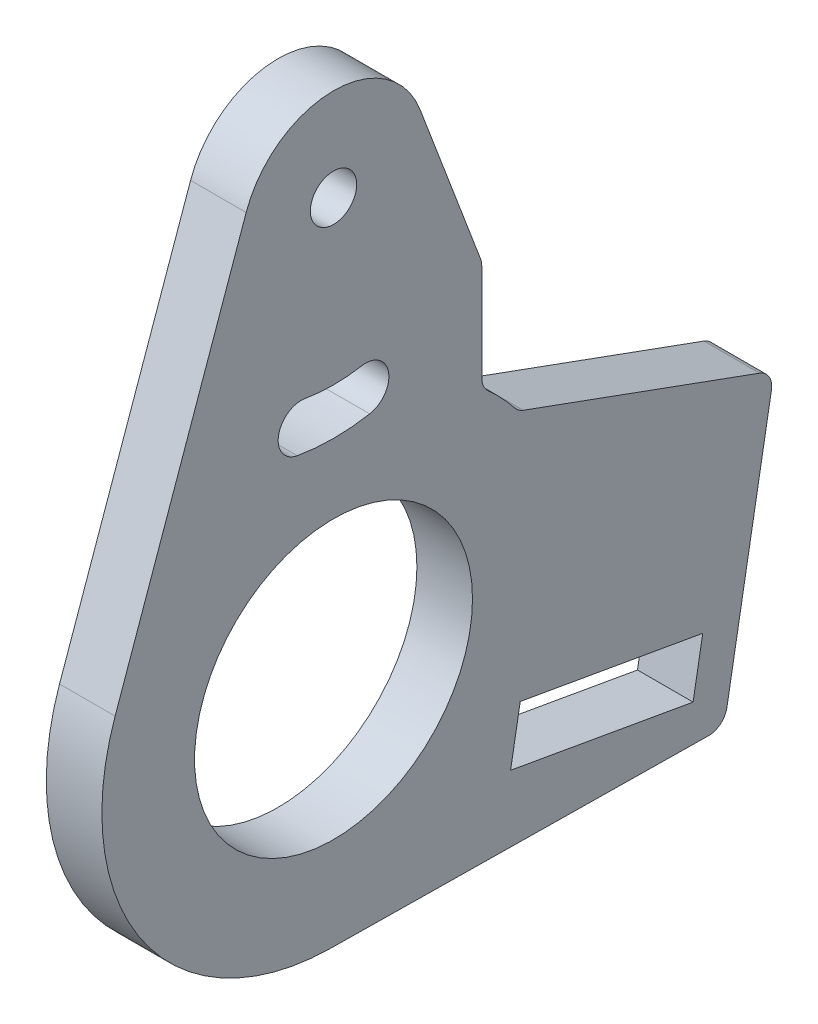
ISO-10303-21;
HEADER;
FILE_DESCRIPTION(('STEP AP214'),'2;1');
FILE_NAME('part.step','',(''),(''),'','','');
FILE_SCHEMA(('AUTOMOTIVE_DESIGN { 1 0 10303 214 1 1 1 1 }'));
ENDSEC;
DATA;
#1=APPLICATION_CONTEXT('core data for automotive mechanical design processes');
#2=APPLICATION_PROTOCOL_DEFINITION('international standard','automotive_design',2000,#1);
#3=PRODUCT_CONTEXT('',#1,'mechanical');
#4=PRODUCT('Part','Part','',(#3));
#5=PRODUCT_RELATED_PRODUCT_CATEGORY('part','',(#4));
#6=PRODUCT_DEFINITION_FORMATION('','',#4);
#7=PRODUCT_DEFINITION_CONTEXT('part definition',#1,'design');
#8=PRODUCT_DEFINITION('design','',#6,#7);
#9=PRODUCT_DEFINITION_SHAPE('','',#8);
#10=(LENGTH_UNIT() NAMED_UNIT(*) SI_UNIT(.MILLI.,.METRE.));
#11=(NAMED_UNIT(*) PLANE_ANGLE_UNIT() SI_UNIT($,.RADIAN.));
#12=(NAMED_UNIT(*) SI_UNIT($,.STERADIAN.) SOLID_ANGLE_UNIT());
#13=UNCERTAINTY_MEASURE_WITH_UNIT(LENGTH_MEASURE(1.E-05),#10,'distance_accuracy_value','');
#14=(GEOMETRIC_REPRESENTATION_CONTEXT(3) GLOBAL_UNCERTAINTY_ASSIGNED_CONTEXT((#13)) GLOBAL_UNIT_ASSIGNED_CONTEXT((#10,
#11,#12)) REPRESENTATION_CONTEXT('',''));
#15=CARTESIAN_POINT('',(0.,0.,0.));
#16=DIRECTION('',(0.,0.,1.));
#17=DIRECTION('',(1.,0.,0.));
#18=AXIS2_PLACEMENT_3D('',#15,#16,#17);
#19=CARTESIAN_POINT('',(6.,-30.,50.));
#20=DIRECTION('',(-1.,0.,0.));
#21=DIRECTION('',(0.,0.,1.));
#22=AXIS2_PLACEMENT_3D('',#19,#20,#21);
#23=PLANE('',#22);
#24=CARTESIAN_POINT('',(6.,15.,50.));
#25=DIRECTION('',(1.,0.,0.));
#26=DIRECTION('',(0.,0.,-1.));
#27=AXIS2_PLACEMENT_3D('',#24,#25,#26);
#28=CIRCLE('',#27,2.49999999999999);
#29=CARTESIAN_POINT('',(6.,15.,47.5));
#30=VERTEX_POINT('',#29);
#31=EDGE_CURVE('E248',#30,#30,#28,.T.);
#32=ORIENTED_EDGE('',*,*,#31,.F.);
#33=EDGE_LOOP('',(#32));
#34=FACE_BOUND('',#33,.T.);
#35=DIRECTION('',(0.,-0.173648177666929,-0.984807753012208));
#36=VECTOR('',#35,1.);
#37=CARTESIAN_POINT('',(6.,-51.5453282947425,11.1938115358795));
#38=LINE('',#37,#36);
#39=CARTESIAN_POINT('',(6.,-48.072364741404,30.8899665961236));
#40=VERTEX_POINT('',#39);
#41=CARTESIAN_POINT('',(6.,-51.5453282947425,11.1938115358795));
#42=VERTEX_POINT('',#41);
#43=EDGE_CURVE('E256',#40,#42,#38,.T.);
#44=ORIENTED_EDGE('',*,*,#43,.F.);
#45=DIRECTION('',(0.,-0.984807753012208,0.173648177666931));
#46=VECTOR('',#45,1.);
#47=CARTESIAN_POINT('',(6.,-48.072364741404,30.8899665961236));
#48=LINE('',#47,#46);
#49=CARTESIAN_POINT('',(6.,-42.1635182233307,29.8480775301221));
#50=VERTEX_POINT('',#49);
#51=EDGE_CURVE('E267',#50,#40,#48,.T.);
#52=ORIENTED_EDGE('',*,*,#51,.F.);
#53=DIRECTION('',(0.,0.173648177666929,0.984807753012208));
#54=VECTOR('',#53,1.);
#55=CARTESIAN_POINT('',(6.,-42.1635182233307,29.8480775301221));
#56=LINE('',#55,#54);
#57=CARTESIAN_POINT('',(6.,-45.6364817766693,10.1519224698779));
#58=VERTEX_POINT('',#57);
#59=EDGE_CURVE('E263',#58,#50,#56,.T.);
#60=ORIENTED_EDGE('',*,*,#59,.F.);
#61=DIRECTION('',(0.,0.984807753012208,-0.173648177666929));
#62=VECTOR('',#61,1.);
#63=CARTESIAN_POINT('',(6.,-45.6364817766693,10.1519224698779));
#64=LINE('',#63,#62);
#65=EDGE_CURVE('E259',#42,#58,#64,.T.);
#66=ORIENTED_EDGE('',*,*,#65,.F.);
#67=EDGE_LOOP('',(#44,#52,#60,#66));
#68=FACE_BOUND('',#67,.T.);
#69=DIRECTION('',(0.,-0.0128836518435518,-0.999917002313279));
#70=VECTOR('',#69,1.);
#71=CARTESIAN_POINT('',(6.,-54.997925057832,50.3220912960888));
#72=LINE('',#71,#70);
#73=CARTESIAN_POINT('',(6.,-54.997925057832,50.3220912960888));
#74=VERTEX_POINT('',#73);
#75=CARTESIAN_POINT('',(6.,-55.5234225515819,9.53754627312334));
#76=VERTEX_POINT('',#75);
#77=EDGE_CURVE('E328',#74,#76,#72,.T.);
#78=ORIENTED_EDGE('',*,*,#77,.T.);
#79=CARTESIAN_POINT('',(6.,-53.5235885469553,9.51177896943623));
#80=DIRECTION('',(-1.,0.,0.));
#81=DIRECTION('',(0.,0.,1.));
#82=AXIS2_PLACEMENT_3D('',#79,#80,#81);
#83=CIRCLE('',#82,2.);
#84=CARTESIAN_POINT('',(6.,-53.8708849022892,7.54216346341182));
#85=VERTEX_POINT('',#84);
#86=EDGE_CURVE('E407',#76,#85,#83,.F.);
#87=ORIENTED_EDGE('',*,*,#86,.T.);
#88=DIRECTION('',(0.,0.984807753012208,-0.17364817766693));
#89=VECTOR('',#88,1.);
#90=CARTESIAN_POINT('',(6.,-55.5453282947425,7.83741301117036));
#91=LINE('',#90,#89);
#92=CARTESIAN_POINT('',(6.,-26.6137294901861,2.73599154689431));
#93=VERTEX_POINT('',#92);
#94=EDGE_CURVE('E332',#85,#93,#91,.T.);
#95=ORIENTED_EDGE('',*,*,#94,.T.);
#96=CARTESIAN_POINT('',(6.,-26.2664331348523,4.70560705291873));
#97=DIRECTION('',(-1.,0.,0.));
#98=DIRECTION('',(0.,0.,1.));
#99=AXIS2_PLACEMENT_3D('',#96,#97,#98);
#100=CIRCLE('',#99,2.);
#101=CARTESIAN_POINT('',(6.,-24.3870478932805,4.02156676626739));
#102=VERTEX_POINT('',#101);
#103=EDGE_CURVE('E66',#93,#102,#100,.F.);
#104=ORIENTED_EDGE('',*,*,#103,.T.);
#105=DIRECTION('',(0.,0.342020143325669,0.939692620785908));
#106=VECTOR('',#105,1.);
#107=CARTESIAN_POINT('',(6.,-14.9058419093169,30.0709661164053));
#108=LINE('',#107,#106);
#109=CARTESIAN_POINT('',(6.,-15.1033502164555,29.5283165023874));
#110=VERTEX_POINT('',#109);
#111=EDGE_CURVE('E335',#102,#110,#108,.T.);
#112=ORIENTED_EDGE('',*,*,#111,.T.);
#113=CARTESIAN_POINT('',(6.,-13.2239649748836,28.8442762157361));
#114=DIRECTION('',(-1.,0.,0.));
#115=DIRECTION('',(0.,0.,1.));
#116=AXIS2_PLACEMENT_3D('',#113,#114,#115);
#117=CIRCLE('',#116,2.);
#118=CARTESIAN_POINT('',(6.,-14.4666342360034,30.4113668664223));
#119=VERTEX_POINT('',#118);
#120=EDGE_CURVE('E437',#110,#119,#117,.T.);
#121=ORIENTED_EDGE('',*,*,#120,.T.);
#122=CARTESIAN_POINT('',(6.,-30.,50.));
#123=DIRECTION('',(1.,0.,0.));
#124=DIRECTION('',(0.,0.,1.));
#125=AXIS2_PLACEMENT_3D('',#122,#123,#124);
#126=CIRCLE('',#125,25.);
#127=CARTESIAN_POINT('',(6.,-11.3661001875018,33.3333333333333));
#128=VERTEX_POINT('',#127);
#129=EDGE_CURVE('E307',#119,#128,#126,.T.);
#130=ORIENTED_EDGE('',*,*,#129,.T.);
#131=CARTESIAN_POINT('',(6.,-9.87538820250189,32.));
#132=DIRECTION('',(-1.,0.,0.));
#133=DIRECTION('',(0.,0.,1.));
#134=AXIS2_PLACEMENT_3D('',#131,#132,#133);
#135=CIRCLE('',#134,2.);
#136=CARTESIAN_POINT('',(6.,-9.87538820250189,34.));
#137=VERTEX_POINT('',#136);
#138=EDGE_CURVE('E11',#128,#137,#135,.T.);
#139=ORIENTED_EDGE('',*,*,#138,.T.);
#140=DIRECTION('',(0.,1.,0.));
#141=VECTOR('',#140,1.);
#142=CARTESIAN_POINT('',(6.,-10.7906272877015,34.));
#143=LINE('',#142,#141);
#144=CARTESIAN_POINT('',(6.,0.633718227746634,34.));
#145=VERTEX_POINT('',#144);
#146=EDGE_CURVE('E311',#137,#145,#143,.T.);
#147=ORIENTED_EDGE('',*,*,#146,.T.);
#148=CARTESIAN_POINT('',(6.,0.633718227746637,36.));
#149=DIRECTION('',(-1.,0.,0.));
#150=DIRECTION('',(0.,0.,1.));
#151=AXIS2_PLACEMENT_3D('',#148,#149,#150);
#152=CIRCLE('',#151,2.);
#153=CARTESIAN_POINT('',(6.,1.34250853141345,34.1298084842915));
#154=VERTEX_POINT('',#153);
#155=EDGE_CURVE('E402',#145,#154,#152,.F.);
#156=ORIENTED_EDGE('',*,*,#155,.T.);
#157=DIRECTION('',(0.,0.935095757854231,0.354395151833405));
#158=VECTOR('',#157,1.);
#159=CARTESIAN_POINT('',(6.,0.999999999999997,34.));
#160=LINE('',#159,#158);
#161=CARTESIAN_POINT('',(6.,18.5439515183341,40.6490424214577));
#162=VERTEX_POINT('',#161);
#163=EDGE_CURVE('E316',#154,#162,#160,.T.);
#164=ORIENTED_EDGE('',*,*,#163,.T.);
#165=CARTESIAN_POINT('',(6.,15.,50.));
#166=DIRECTION('',(1.,0.,0.));
#167=DIRECTION('',(0.,0.,-1.));
#168=AXIS2_PLACEMENT_3D('',#165,#166,#167);
#169=CIRCLE('',#168,10.);
#170=CARTESIAN_POINT('',(6.,18.3333333333333,59.4280904158206));
#171=VERTEX_POINT('',#170);
#172=EDGE_CURVE('E319',#162,#171,#169,.T.);
#173=ORIENTED_EDGE('',*,*,#172,.T.);
#174=DIRECTION('',(0.,-0.942809041582063,0.333333333333333));
#175=VECTOR('',#174,1.);
#176=CARTESIAN_POINT('',(6.,18.3333333333333,59.4280904158206));
#177=LINE('',#176,#175);
#178=CARTESIAN_POINT('',(6.,-21.6666666666667,73.5702260395516));
#179=VERTEX_POINT('',#178);
#180=EDGE_CURVE('E322',#171,#179,#177,.T.);
#181=ORIENTED_EDGE('',*,*,#180,.T.);
#182=CARTESIAN_POINT('',(6.,-30.,50.));
#183=DIRECTION('',(1.,0.,0.));
#184=DIRECTION('',(0.,0.,-1.));
#185=AXIS2_PLACEMENT_3D('',#182,#183,#184);
#186=CIRCLE('',#185,25.);
#187=EDGE_CURVE('E325',#179,#74,#186,.T.);
#188=ORIENTED_EDGE('',*,*,#187,.T.);
#189=EDGE_LOOP('',(#78,#87,#95,#104,#112,#121,#130,#139,#147,#156,#164,#173,#181,#188));
#190=FACE_BOUND('',#189,.T.);
#191=CARTESIAN_POINT('',(6.,-30.,50.));
#192=DIRECTION('',(1.,0.,0.));
#193=DIRECTION('',(0.,0.,-1.));
#194=AXIS2_PLACEMENT_3D('',#191,#192,#193);
#195=CIRCLE('',#194,15.);
#196=CARTESIAN_POINT('',(6.,-30.,35.));
#197=VERTEX_POINT('',#196);
#198=EDGE_CURVE('E299',#197,#197,#195,.T.);
#199=ORIENTED_EDGE('',*,*,#198,.F.);
#200=EDGE_LOOP('',(#199));
#201=FACE_BOUND('',#200,.T.);
#202=CARTESIAN_POINT('',(6.,15.,50.));
#203=DIRECTION('',(-1.,0.,0.));
#204=DIRECTION('',(0.,0.,-1.));
#205=AXIS2_PLACEMENT_3D('',#202,#203,#204);
#206=CIRCLE('',#205,17.5);
#207=CARTESIAN_POINT('',(6.,-2.23413567771363,46.9611568908287));
#208=VERTEX_POINT('',#207);
#209=CARTESIAN_POINT('',(6.,-2.23413567771363,53.0388431091713));
#210=VERTEX_POINT('',#209);
#211=EDGE_CURVE('E195',#208,#210,#206,.T.);
#212=ORIENTED_EDGE('',*,*,#211,.F.);
#213=CARTESIAN_POINT('',(6.,-4.69615506024415,46.5270364466614));
#214=DIRECTION('',(1.,0.,0.));
#215=DIRECTION('',(0.,0.,-1.));
#216=AXIS2_PLACEMENT_3D('',#213,#214,#215);
#217=CIRCLE('',#216,2.5);
#218=CARTESIAN_POINT('',(6.,-7.15817444277467,46.092916002494));
#219=VERTEX_POINT('',#218);
#220=EDGE_CURVE('E224',#219,#208,#217,.T.);
#221=ORIENTED_EDGE('',*,*,#220,.F.);
#222=CARTESIAN_POINT('',(6.,15.,50.));
#223=DIRECTION('',(1.,0.,0.));
#224=DIRECTION('',(0.,0.,-1.));
#225=AXIS2_PLACEMENT_3D('',#222,#223,#224);
#226=CIRCLE('',#225,22.5);
#227=CARTESIAN_POINT('',(6.,-7.15817444277467,53.907083997506));
#228=VERTEX_POINT('',#227);
#229=EDGE_CURVE('E220',#228,#219,#226,.T.);
#230=ORIENTED_EDGE('',*,*,#229,.F.);
#231=CARTESIAN_POINT('',(6.,-4.69615506024415,53.4729635533386));
#232=DIRECTION('',(1.,0.,0.));
#233=DIRECTION('',(0.,0.,-1.));
#234=AXIS2_PLACEMENT_3D('',#231,#232,#233);
#235=CIRCLE('',#234,2.5);
#236=EDGE_CURVE('E206',#210,#228,#235,.T.);
#237=ORIENTED_EDGE('',*,*,#236,.F.);
#238=EDGE_LOOP('',(#212,#221,#230,#237));
#239=FACE_BOUND('',#238,.T.);
#240=ADVANCED_FACE('F43',(#34,#68,#190,#201,#239),#23,.F.);
#241=CARTESIAN_POINT('',(0.,-30.,50.));
#242=DIRECTION('',(-1.,0.,0.));
#243=DIRECTION('',(0.,0.,1.));
#244=AXIS2_PLACEMENT_3D('',#241,#242,#243);
#245=PLANE('',#244);
#246=DIRECTION('',(0.,-0.984807753012208,0.173648177666931));
#247=VECTOR('',#246,1.);
#248=CARTESIAN_POINT('',(0.,-48.072364741404,30.8899665961236));
#249=LINE('',#248,#247);
#250=CARTESIAN_POINT('',(0.,-42.1635182233307,29.8480775301221));
#251=VERTEX_POINT('',#250);
#252=CARTESIAN_POINT('',(0.,-48.072364741404,30.8899665961236));
#253=VERTEX_POINT('',#252);
#254=EDGE_CURVE('E260',#251,#253,#249,.T.);
#255=ORIENTED_EDGE('',*,*,#254,.T.);
#256=DIRECTION('',(0.,-0.173648177666929,-0.984807753012208));
#257=VECTOR('',#256,1.);
#258=CARTESIAN_POINT('',(0.,-51.5453282947425,11.1938115358795));
#259=LINE('',#258,#257);
#260=CARTESIAN_POINT('',(0.,-51.5453282947425,11.1938115358795));
#261=VERTEX_POINT('',#260);
#262=EDGE_CURVE('E252',#253,#261,#259,.T.);
#263=ORIENTED_EDGE('',*,*,#262,.T.);
#264=DIRECTION('',(0.,0.984807753012208,-0.173648177666929));
#265=VECTOR('',#264,1.);
#266=CARTESIAN_POINT('',(0.,-45.6364817766693,10.1519224698779));
#267=LINE('',#266,#265);
#268=CARTESIAN_POINT('',(0.,-45.6364817766693,10.1519224698779));
#269=VERTEX_POINT('',#268);
#270=EDGE_CURVE('E274',#261,#269,#267,.T.);
#271=ORIENTED_EDGE('',*,*,#270,.T.);
#272=DIRECTION('',(0.,0.173648177666929,0.984807753012208));
#273=VECTOR('',#272,1.);
#274=CARTESIAN_POINT('',(0.,-42.1635182233307,29.8480775301221));
#275=LINE('',#274,#273);
#276=EDGE_CURVE('E278',#269,#251,#275,.T.);
#277=ORIENTED_EDGE('',*,*,#276,.T.);
#278=EDGE_LOOP('',(#255,#263,#271,#277));
#279=FACE_BOUND('',#278,.T.);
#280=CARTESIAN_POINT('',(0.,-30.,50.));
#281=DIRECTION('',(1.,0.,0.));
#282=DIRECTION('',(0.,0.,-1.));
#283=AXIS2_PLACEMENT_3D('',#280,#281,#282);
#284=CIRCLE('',#283,15.);
#285=CARTESIAN_POINT('',(0.,-30.,35.));
#286=VERTEX_POINT('',#285);
#287=EDGE_CURVE('E298',#286,#286,#284,.T.);
#288=ORIENTED_EDGE('',*,*,#287,.T.);
#289=EDGE_LOOP('',(#288));
#290=FACE_BOUND('',#289,.T.);
#291=DIRECTION('',(0.,0.984807753012208,-0.17364817766693));
#292=VECTOR('',#291,1.);
#293=CARTESIAN_POINT('',(0.,-55.5453282947425,7.83741301117036));
#294=LINE('',#293,#292);
#295=CARTESIAN_POINT('',(0.,-53.8708849022892,7.54216346341182));
#296=VERTEX_POINT('',#295);
#297=CARTESIAN_POINT('',(0.,-26.6137294901861,2.73599154689431));
#298=VERTEX_POINT('',#297);
#299=EDGE_CURVE('E362',#296,#298,#294,.T.);
#300=ORIENTED_EDGE('',*,*,#299,.F.);
#301=CARTESIAN_POINT('',(0.,-53.5235885469553,9.51177896943623));
#302=DIRECTION('',(-1.,0.,0.));
#303=DIRECTION('',(0.,0.,1.));
#304=AXIS2_PLACEMENT_3D('',#301,#302,#303);
#305=CIRCLE('',#304,2.);
#306=CARTESIAN_POINT('',(0.,-55.5234225515819,9.53754627312334));
#307=VERTEX_POINT('',#306);
#308=EDGE_CURVE('E396',#296,#307,#305,.T.);
#309=ORIENTED_EDGE('',*,*,#308,.T.);
#310=DIRECTION('',(0.,-0.0128836518435518,-0.999917002313279));
#311=VECTOR('',#310,1.);
#312=CARTESIAN_POINT('',(0.,-54.997925057832,50.3220912960888));
#313=LINE('',#312,#311);
#314=CARTESIAN_POINT('',(0.,-54.997925057832,50.3220912960888));
#315=VERTEX_POINT('',#314);
#316=EDGE_CURVE('E358',#315,#307,#313,.T.);
#317=ORIENTED_EDGE('',*,*,#316,.F.);
#318=CARTESIAN_POINT('',(0.,-30.,50.));
#319=DIRECTION('',(1.,0.,0.));
#320=DIRECTION('',(0.,0.,-1.));
#321=AXIS2_PLACEMENT_3D('',#318,#319,#320);
#322=CIRCLE('',#321,25.);
#323=CARTESIAN_POINT('',(0.,-21.6666666666667,73.5702260395516));
#324=VERTEX_POINT('',#323);
#325=EDGE_CURVE('E355',#324,#315,#322,.T.);
#326=ORIENTED_EDGE('',*,*,#325,.F.);
#327=DIRECTION('',(0.,-0.942809041582063,0.333333333333333));
#328=VECTOR('',#327,1.);
#329=CARTESIAN_POINT('',(0.,18.3333333333333,59.4280904158206));
#330=LINE('',#329,#328);
#331=CARTESIAN_POINT('',(0.,18.3333333333333,59.4280904158206));
#332=VERTEX_POINT('',#331);
#333=EDGE_CURVE('E352',#332,#324,#330,.T.);
#334=ORIENTED_EDGE('',*,*,#333,.F.);
#335=CARTESIAN_POINT('',(0.,15.,50.));
#336=DIRECTION('',(1.,0.,0.));
#337=DIRECTION('',(0.,0.,-1.));
#338=AXIS2_PLACEMENT_3D('',#335,#336,#337);
#339=CIRCLE('',#338,10.);
#340=CARTESIAN_POINT('',(0.,18.5439515183341,40.6490424214577));
#341=VERTEX_POINT('',#340);
#342=EDGE_CURVE('E349',#341,#332,#339,.T.);
#343=ORIENTED_EDGE('',*,*,#342,.F.);
#344=DIRECTION('',(0.,0.935095757854231,0.354395151833405));
#345=VECTOR('',#344,1.);
#346=CARTESIAN_POINT('',(0.,0.999999999999997,34.));
#347=LINE('',#346,#345);
#348=CARTESIAN_POINT('',(0.,1.34250853141345,34.1298084842915));
#349=VERTEX_POINT('',#348);
#350=EDGE_CURVE('E346',#349,#341,#347,.T.);
#351=ORIENTED_EDGE('',*,*,#350,.F.);
#352=CARTESIAN_POINT('',(0.,0.633718227746637,36.));
#353=DIRECTION('',(-1.,0.,0.));
#354=DIRECTION('',(0.,0.,1.));
#355=AXIS2_PLACEMENT_3D('',#352,#353,#354);
#356=CIRCLE('',#355,2.);
#357=CARTESIAN_POINT('',(0.,0.633718227746634,34.));
#358=VERTEX_POINT('',#357);
#359=EDGE_CURVE('E390',#349,#358,#356,.T.);
#360=ORIENTED_EDGE('',*,*,#359,.T.);
#361=DIRECTION('',(0.,1.,0.));
#362=VECTOR('',#361,1.);
#363=CARTESIAN_POINT('',(0.,-10.7906272877015,34.));
#364=LINE('',#363,#362);
#365=CARTESIAN_POINT('',(0.,-9.87538820250189,34.));
#366=VERTEX_POINT('',#365);
#367=EDGE_CURVE('E342',#366,#358,#364,.T.);
#368=ORIENTED_EDGE('',*,*,#367,.F.);
#369=CARTESIAN_POINT('',(0.,-9.87538820250189,32.));
#370=DIRECTION('',(-1.,0.,0.));
#371=DIRECTION('',(0.,0.,1.));
#372=AXIS2_PLACEMENT_3D('',#369,#370,#371);
#373=CIRCLE('',#372,2.);
#374=CARTESIAN_POINT('',(0.,-11.3661001875018,33.3333333333333));
#375=VERTEX_POINT('',#374);
#376=EDGE_CURVE('E52',#366,#375,#373,.F.);
#377=ORIENTED_EDGE('',*,*,#376,.T.);
#378=CARTESIAN_POINT('',(0.,-30.,50.));
#379=DIRECTION('',(1.,0.,0.));
#380=DIRECTION('',(0.,0.,1.));
#381=AXIS2_PLACEMENT_3D('',#378,#379,#380);
#382=CIRCLE('',#381,25.);
#383=CARTESIAN_POINT('',(0.,-14.4666342360034,30.4113668664223));
#384=VERTEX_POINT('',#383);
#385=EDGE_CURVE('E303',#384,#375,#382,.T.);
#386=ORIENTED_EDGE('',*,*,#385,.F.);
#387=CARTESIAN_POINT('',(0.,-13.2239649748836,28.8442762157361));
#388=DIRECTION('',(-1.,0.,0.));
#389=DIRECTION('',(0.,0.,1.));
#390=AXIS2_PLACEMENT_3D('',#387,#388,#389);
#391=CIRCLE('',#390,2.);
#392=CARTESIAN_POINT('',(0.,-15.1033502164555,29.5283165023874));
#393=VERTEX_POINT('',#392);
#394=EDGE_CURVE('E434',#384,#393,#391,.F.);
#395=ORIENTED_EDGE('',*,*,#394,.T.);
#396=DIRECTION('',(0.,0.342020143325669,0.939692620785908));
#397=VECTOR('',#396,1.);
#398=CARTESIAN_POINT('',(0.,-14.9058419093169,30.0709661164053));
#399=LINE('',#398,#397);
#400=CARTESIAN_POINT('',(0.,-24.3870478932805,4.02156676626739));
#401=VERTEX_POINT('',#400);
#402=EDGE_CURVE('E312',#401,#393,#399,.T.);
#403=ORIENTED_EDGE('',*,*,#402,.F.);
#404=CARTESIAN_POINT('',(0.,-26.2664331348523,4.70560705291873));
#405=DIRECTION('',(-1.,0.,0.));
#406=DIRECTION('',(0.,0.,1.));
#407=AXIS2_PLACEMENT_3D('',#404,#405,#406);
#408=CIRCLE('',#407,2.);
#409=EDGE_CURVE('E393',#401,#298,#408,.T.);
#410=ORIENTED_EDGE('',*,*,#409,.T.);
#411=EDGE_LOOP('',(#300,#309,#317,#326,#334,#343,#351,#360,#368,#377,#386,#395,#403,#410));
#412=FACE_BOUND('',#411,.T.);
#413=CARTESIAN_POINT('',(0.,15.,50.));
#414=DIRECTION('',(1.,0.,0.));
#415=DIRECTION('',(0.,0.,-1.));
#416=AXIS2_PLACEMENT_3D('',#413,#414,#415);
#417=CIRCLE('',#416,2.49999999999999);
#418=CARTESIAN_POINT('',(0.,15.,47.5));
#419=VERTEX_POINT('',#418);
#420=EDGE_CURVE('E215',#419,#419,#417,.T.);
#421=ORIENTED_EDGE('',*,*,#420,.T.);
#422=EDGE_LOOP('',(#421));
#423=FACE_BOUND('',#422,.T.);
#424=CARTESIAN_POINT('',(0.,-4.69615506024415,46.5270364466614));
#425=DIRECTION('',(1.,0.,0.));
#426=DIRECTION('',(0.,0.,-1.));
#427=AXIS2_PLACEMENT_3D('',#424,#425,#426);
#428=CIRCLE('',#427,2.5);
#429=CARTESIAN_POINT('',(0.,-7.15817444277467,46.092916002494));
#430=VERTEX_POINT('',#429);
#431=CARTESIAN_POINT('',(0.,-2.23413567771363,46.9611568908287));
#432=VERTEX_POINT('',#431);
#433=EDGE_CURVE('E207',#430,#432,#428,.T.);
#434=ORIENTED_EDGE('',*,*,#433,.T.);
#435=CARTESIAN_POINT('',(0.,15.,50.));
#436=DIRECTION('',(-1.,0.,0.));
#437=DIRECTION('',(0.,0.,-1.));
#438=AXIS2_PLACEMENT_3D('',#435,#436,#437);
#439=CIRCLE('',#438,17.5);
#440=CARTESIAN_POINT('',(0.,-2.23413567771363,53.0388431091713));
#441=VERTEX_POINT('',#440);
#442=EDGE_CURVE('E229',#432,#441,#439,.T.);
#443=ORIENTED_EDGE('',*,*,#442,.T.);
#444=CARTESIAN_POINT('',(0.,-4.69615506024415,53.4729635533386));
#445=DIRECTION('',(1.,0.,0.));
#446=DIRECTION('',(0.,0.,-1.));
#447=AXIS2_PLACEMENT_3D('',#444,#445,#446);
#448=CIRCLE('',#447,2.5);
#449=CARTESIAN_POINT('',(0.,-7.15817444277467,53.907083997506));
#450=VERTEX_POINT('',#449);
#451=EDGE_CURVE('E213',#441,#450,#448,.T.);
#452=ORIENTED_EDGE('',*,*,#451,.T.);
#453=CARTESIAN_POINT('',(0.,15.,50.));
#454=DIRECTION('',(1.,0.,0.));
#455=DIRECTION('',(0.,0.,-1.));
#456=AXIS2_PLACEMENT_3D('',#453,#454,#455);
#457=CIRCLE('',#456,22.5);
#458=EDGE_CURVE('E234',#450,#430,#457,.T.);
#459=ORIENTED_EDGE('',*,*,#458,.T.);
#460=EDGE_LOOP('',(#434,#443,#452,#459));
#461=FACE_BOUND('',#460,.T.);
#462=ADVANCED_FACE('F444',(#279,#290,#412,#423,#461),#245,.T.);
#463=CARTESIAN_POINT('',(6.,-30.,50.));
#464=DIRECTION('',(-1.,0.,0.));
#465=DIRECTION('',(0.,0.,1.));
#466=AXIS2_PLACEMENT_3D('',#463,#464,#465);
#467=CYLINDRICAL_SURFACE('',#466,25.);
#468=ORIENTED_EDGE('',*,*,#129,.F.);
#469=DIRECTION('',(-1.,0.,0.));
#470=VECTOR('',#469,1.);
#471=CARTESIAN_POINT('',(6.,-14.4666342360034,30.4113668664223));
#472=LINE('',#471,#470);
#473=EDGE_CURVE('E419',#119,#384,#472,.T.);
#474=ORIENTED_EDGE('',*,*,#473,.T.);
#475=ORIENTED_EDGE('',*,*,#385,.T.);
#476=DIRECTION('',(-1.,0.,0.));
#477=VECTOR('',#476,1.);
#478=CARTESIAN_POINT('',(6.,-11.3661001875018,33.3333333333333));
#479=LINE('',#478,#477);
#480=EDGE_CURVE('E416',#375,#128,#479,.F.);
#481=ORIENTED_EDGE('',*,*,#480,.T.);
#482=EDGE_LOOP('',(#468,#474,#475,#481));
#483=FACE_BOUND('',#482,.T.);
#484=ADVANCED_FACE('F451',(#483),#467,.T.);
#485=CARTESIAN_POINT('',(6.,-10.7906272877015,34.));
#486=DIRECTION('',(0.,0.,1.));
#487=DIRECTION('',(1.,0.,0.));
#488=AXIS2_PLACEMENT_3D('',#485,#486,#487);
#489=PLANE('',#488);
#490=ORIENTED_EDGE('',*,*,#367,.T.);
#491=DIRECTION('',(-1.,0.,0.));
#492=VECTOR('',#491,1.);
#493=CARTESIAN_POINT('',(6.,0.633718227746638,34.));
#494=LINE('',#493,#492);
#495=EDGE_CURVE('E431',#358,#145,#494,.F.);
#496=ORIENTED_EDGE('',*,*,#495,.T.);
#497=ORIENTED_EDGE('',*,*,#146,.F.);
#498=DIRECTION('',(1.,0.,0.));
#499=VECTOR('',#498,1.);
#500=CARTESIAN_POINT('',(0.,-9.87538820250189,34.));
#501=LINE('',#500,#499);
#502=EDGE_CURVE('E427',#137,#366,#501,.F.);
#503=ORIENTED_EDGE('',*,*,#502,.T.);
#504=EDGE_LOOP('',(#490,#496,#497,#503));
#505=FACE_BOUND('',#504,.T.);
#506=ADVANCED_FACE('F458',(#505),#489,.F.);
#507=CARTESIAN_POINT('',(6.,0.999999999999997,34.));
#508=DIRECTION('',(0.,-0.354395151833405,0.93509575785423));
#509=DIRECTION('',(0.,-0.935095757854231,-0.354395151833405));
#510=AXIS2_PLACEMENT_3D('',#507,#508,#509);
#511=PLANE('',#510);
#512=ORIENTED_EDGE('',*,*,#163,.F.);
#513=DIRECTION('',(-1.,0.,0.));
#514=VECTOR('',#513,1.);
#515=CARTESIAN_POINT('',(6.,1.34250853141345,34.1298084842915));
#516=LINE('',#515,#514);
#517=EDGE_CURVE('E423',#154,#349,#516,.T.);
#518=ORIENTED_EDGE('',*,*,#517,.T.);
#519=ORIENTED_EDGE('',*,*,#350,.T.);
#520=DIRECTION('',(-1.,0.,0.));
#521=VECTOR('',#520,1.);
#522=CARTESIAN_POINT('',(6.,18.5439515183341,40.6490424214577));
#523=LINE('',#522,#521);
#524=EDGE_CURVE('E379',#162,#341,#523,.T.);
#525=ORIENTED_EDGE('',*,*,#524,.F.);
#526=EDGE_LOOP('',(#512,#518,#519,#525));
#527=FACE_BOUND('',#526,.T.);
#528=ADVANCED_FACE('F466',(#527),#511,.F.);
#529=CARTESIAN_POINT('',(6.,15.,50.));
#530=DIRECTION('',(-1.,0.,0.));
#531=DIRECTION('',(0.,0.,1.));
#532=AXIS2_PLACEMENT_3D('',#529,#530,#531);
#533=CYLINDRICAL_SURFACE('',#532,10.);
#534=ORIENTED_EDGE('',*,*,#342,.T.);
#535=DIRECTION('',(-1.,0.,0.));
#536=VECTOR('',#535,1.);
#537=CARTESIAN_POINT('',(6.,18.3333333333333,59.4280904158206));
#538=LINE('',#537,#536);
#539=EDGE_CURVE('E375',#171,#332,#538,.T.);
#540=ORIENTED_EDGE('',*,*,#539,.F.);
#541=ORIENTED_EDGE('',*,*,#172,.F.);
#542=ORIENTED_EDGE('',*,*,#524,.T.);
#543=EDGE_LOOP('',(#534,#540,#541,#542));
#544=FACE_BOUND('',#543,.T.);
#545=ADVANCED_FACE('F472',(#544),#533,.T.);
#546=CARTESIAN_POINT('',(6.,18.3333333333333,59.4280904158206));
#547=DIRECTION('',(0.,-0.333333333333333,-0.942809041582063));
#548=DIRECTION('',(0.,0.942809041582064,-0.333333333333333));
#549=AXIS2_PLACEMENT_3D('',#546,#547,#548);
#550=PLANE('',#549);
#551=ORIENTED_EDGE('',*,*,#333,.T.);
#552=DIRECTION('',(-1.,0.,0.));
#553=VECTOR('',#552,1.);
#554=CARTESIAN_POINT('',(6.,-21.6666666666667,73.5702260395516));
#555=LINE('',#554,#553);
#556=EDGE_CURVE('E371',#179,#324,#555,.T.);
#557=ORIENTED_EDGE('',*,*,#556,.F.);
#558=ORIENTED_EDGE('',*,*,#180,.F.);
#559=ORIENTED_EDGE('',*,*,#539,.T.);
#560=EDGE_LOOP('',(#551,#557,#558,#559));
#561=FACE_BOUND('',#560,.T.);
#562=ADVANCED_FACE('F478',(#561),#550,.F.);
#563=CARTESIAN_POINT('',(6.,-30.,50.));
#564=DIRECTION('',(-1.,0.,0.));
#565=DIRECTION('',(0.,0.,1.));
#566=AXIS2_PLACEMENT_3D('',#563,#564,#565);
#567=CYLINDRICAL_SURFACE('',#566,25.);
#568=ORIENTED_EDGE('',*,*,#325,.T.);
#569=DIRECTION('',(-1.,0.,0.));
#570=VECTOR('',#569,1.);
#571=CARTESIAN_POINT('',(6.,-54.997925057832,50.3220912960888));
#572=LINE('',#571,#570);
#573=EDGE_CURVE('E338',#74,#315,#572,.T.);
#574=ORIENTED_EDGE('',*,*,#573,.F.);
#575=ORIENTED_EDGE('',*,*,#187,.F.);
#576=ORIENTED_EDGE('',*,*,#556,.T.);
#577=EDGE_LOOP('',(#568,#574,#575,#576));
#578=FACE_BOUND('',#577,.T.);
#579=ADVANCED_FACE('F482',(#578),#567,.T.);
#580=CARTESIAN_POINT('',(6.,-54.997925057832,50.3220912960888));
#581=DIRECTION('',(0.,0.999917002313279,-0.0128836518435518));
#582=DIRECTION('',(0.,0.0128836518435518,0.999917002313279));
#583=AXIS2_PLACEMENT_3D('',#580,#581,#582);
#584=PLANE('',#583);
#585=ORIENTED_EDGE('',*,*,#316,.T.);
#586=DIRECTION('',(-1.,0.,0.));
#587=VECTOR('',#586,1.);
#588=CARTESIAN_POINT('',(6.,-55.5234225515819,9.53754627312334));
#589=LINE('',#588,#587);
#590=EDGE_CURVE('E399',#307,#76,#589,.F.);
#591=ORIENTED_EDGE('',*,*,#590,.T.);
#592=ORIENTED_EDGE('',*,*,#77,.F.);
#593=ORIENTED_EDGE('',*,*,#573,.T.);
#594=EDGE_LOOP('',(#585,#591,#592,#593));
#595=FACE_BOUND('',#594,.T.);
#596=ADVANCED_FACE('F486',(#595),#584,.F.);
#597=CARTESIAN_POINT('',(6.,-55.5453282947425,7.83741301117036));
#598=DIRECTION('',(0.,0.173648177666929,0.984807753012208));
#599=DIRECTION('',(0.,-0.984807753012208,0.17364817766693));
#600=AXIS2_PLACEMENT_3D('',#597,#598,#599);
#601=PLANE('',#600);
#602=ORIENTED_EDGE('',*,*,#94,.F.);
#603=DIRECTION('',(-1.,0.,0.));
#604=VECTOR('',#603,1.);
#605=CARTESIAN_POINT('',(6.,-53.8708849022892,7.54216346341182));
#606=LINE('',#605,#604);
#607=EDGE_CURVE('E386',#85,#296,#606,.T.);
#608=ORIENTED_EDGE('',*,*,#607,.T.);
#609=ORIENTED_EDGE('',*,*,#299,.T.);
#610=DIRECTION('',(-1.,0.,0.));
#611=VECTOR('',#610,1.);
#612=CARTESIAN_POINT('',(6.,-26.6137294901861,2.73599154689432));
#613=LINE('',#612,#611);
#614=EDGE_CURVE('E383',#298,#93,#613,.F.);
#615=ORIENTED_EDGE('',*,*,#614,.T.);
#616=EDGE_LOOP('',(#602,#608,#609,#615));
#617=FACE_BOUND('',#616,.T.);
#618=ADVANCED_FACE('F494',(#617),#601,.F.);
#619=CARTESIAN_POINT('',(6.,-14.9058419093169,30.0709661164053));
#620=DIRECTION('',(0.,-0.939692620785909,0.342020143325669));
#621=DIRECTION('',(0.,-0.342020143325669,-0.939692620785909));
#622=AXIS2_PLACEMENT_3D('',#619,#620,#621);
#623=PLANE('',#622);
#624=ORIENTED_EDGE('',*,*,#111,.F.);
#625=DIRECTION('',(-1.,0.,0.));
#626=VECTOR('',#625,1.);
#627=CARTESIAN_POINT('',(6.,-24.3870478932805,4.0215667662674));
#628=LINE('',#627,#626);
#629=EDGE_CURVE('E412',#102,#401,#628,.T.);
#630=ORIENTED_EDGE('',*,*,#629,.T.);
#631=ORIENTED_EDGE('',*,*,#402,.T.);
#632=DIRECTION('',(1.,0.,0.));
#633=VECTOR('',#632,1.);
#634=CARTESIAN_POINT('',(6.,-15.1033502164555,29.5283165023874));
#635=LINE('',#634,#633);
#636=EDGE_CURVE('E59',#393,#110,#635,.T.);
#637=ORIENTED_EDGE('',*,*,#636,.T.);
#638=EDGE_LOOP('',(#624,#630,#631,#637));
#639=FACE_BOUND('',#638,.T.);
#640=ADVANCED_FACE('F500',(#639),#623,.F.);
#641=CARTESIAN_POINT('',(6.,-30.,50.));
#642=DIRECTION('',(-1.,0.,0.));
#643=DIRECTION('',(0.,0.,1.));
#644=AXIS2_PLACEMENT_3D('',#641,#642,#643);
#645=CYLINDRICAL_SURFACE('',#644,15.);
#646=ORIENTED_EDGE('',*,*,#198,.T.);
#647=EDGE_LOOP('',(#646));
#648=FACE_BOUND('',#647,.T.);
#649=ORIENTED_EDGE('',*,*,#287,.F.);
#650=EDGE_LOOP('',(#649));
#651=FACE_BOUND('',#650,.T.);
#652=ADVANCED_FACE('F522',(#648,#651),#645,.F.);
#653=CARTESIAN_POINT('',(6.,-51.5453282947425,11.1938115358795));
#654=DIRECTION('',(0.,0.984807753012208,-0.173648177666929));
#655=DIRECTION('',(0.,0.173648177666929,0.984807753012208));
#656=AXIS2_PLACEMENT_3D('',#653,#654,#655);
#657=PLANE('',#656);
#658=ORIENTED_EDGE('',*,*,#262,.F.);
#659=DIRECTION('',(-1.,0.,0.));
#660=VECTOR('',#659,1.);
#661=CARTESIAN_POINT('',(6.,-48.072364741404,30.8899665961236));
#662=LINE('',#661,#660);
#663=EDGE_CURVE('E270',#40,#253,#662,.T.);
#664=ORIENTED_EDGE('',*,*,#663,.F.);
#665=ORIENTED_EDGE('',*,*,#43,.T.);
#666=DIRECTION('',(-1.,0.,0.));
#667=VECTOR('',#666,1.);
#668=CARTESIAN_POINT('',(6.,-51.5453282947425,11.1938115358795));
#669=LINE('',#668,#667);
#670=EDGE_CURVE('E294',#42,#261,#669,.T.);
#671=ORIENTED_EDGE('',*,*,#670,.T.);
#672=EDGE_LOOP('',(#658,#664,#665,#671));
#673=FACE_BOUND('',#672,.T.);
#674=ADVANCED_FACE('F576',(#673),#657,.T.);
#675=CARTESIAN_POINT('',(6.,-45.6364817766693,10.1519224698779));
#676=DIRECTION('',(0.,0.173648177666929,0.984807753012208));
#677=DIRECTION('',(0.,-0.984807753012208,0.173648177666929));
#678=AXIS2_PLACEMENT_3D('',#675,#676,#677);
#679=PLANE('',#678);
#680=ORIENTED_EDGE('',*,*,#270,.F.);
#681=ORIENTED_EDGE('',*,*,#670,.F.);
#682=ORIENTED_EDGE('',*,*,#65,.T.);
#683=DIRECTION('',(-1.,0.,0.));
#684=VECTOR('',#683,1.);
#685=CARTESIAN_POINT('',(6.,-45.6364817766693,10.1519224698779));
#686=LINE('',#685,#684);
#687=EDGE_CURVE('E291',#58,#269,#686,.T.);
#688=ORIENTED_EDGE('',*,*,#687,.T.);
#689=EDGE_LOOP('',(#680,#681,#682,#688));
#690=FACE_BOUND('',#689,.T.);
#691=ADVANCED_FACE('F573',(#690),#679,.T.);
#692=CARTESIAN_POINT('',(6.,-42.1635182233307,29.8480775301221));
#693=DIRECTION('',(0.,-0.984807753012208,0.173648177666929));
#694=DIRECTION('',(0.,-0.173648177666929,-0.984807753012208));
#695=AXIS2_PLACEMENT_3D('',#692,#693,#694);
#696=PLANE('',#695);
#697=ORIENTED_EDGE('',*,*,#276,.F.);
#698=ORIENTED_EDGE('',*,*,#687,.F.);
#699=ORIENTED_EDGE('',*,*,#59,.T.);
#700=DIRECTION('',(-1.,0.,0.));
#701=VECTOR('',#700,1.);
#702=CARTESIAN_POINT('',(6.,-42.1635182233307,29.8480775301221));
#703=LINE('',#702,#701);
#704=EDGE_CURVE('E288',#50,#251,#703,.T.);
#705=ORIENTED_EDGE('',*,*,#704,.T.);
#706=EDGE_LOOP('',(#697,#698,#699,#705));
#707=FACE_BOUND('',#706,.T.);
#708=ADVANCED_FACE('F569',(#707),#696,.T.);
#709=CARTESIAN_POINT('',(6.,-48.072364741404,30.8899665961236));
#710=DIRECTION('',(0.,-0.173648177666931,-0.984807753012208));
#711=DIRECTION('',(0.,0.984807753012208,-0.173648177666931));
#712=AXIS2_PLACEMENT_3D('',#709,#710,#711);
#713=PLANE('',#712);
#714=ORIENTED_EDGE('',*,*,#254,.F.);
#715=ORIENTED_EDGE('',*,*,#704,.F.);
#716=ORIENTED_EDGE('',*,*,#51,.T.);
#717=ORIENTED_EDGE('',*,*,#663,.T.);
#718=EDGE_LOOP('',(#714,#715,#716,#717));
#719=FACE_BOUND('',#718,.T.);
#720=ADVANCED_FACE('F565',(#719),#713,.T.);
#721=CARTESIAN_POINT('',(6.,15.,50.));
#722=DIRECTION('',(-1.,0.,0.));
#723=DIRECTION('',(0.,0.,1.));
#724=AXIS2_PLACEMENT_3D('',#721,#722,#723);
#725=CYLINDRICAL_SURFACE('',#724,2.49999999999999);
#726=ORIENTED_EDGE('',*,*,#31,.T.);
#727=EDGE_LOOP('',(#726));
#728=FACE_BOUND('',#727,.T.);
#729=ORIENTED_EDGE('',*,*,#420,.F.);
#730=EDGE_LOOP('',(#729));
#731=FACE_BOUND('',#730,.T.);
#732=ADVANCED_FACE('F562',(#728,#731),#725,.F.);
#733=CARTESIAN_POINT('',(6.,15.,50.));
#734=DIRECTION('',(-1.,0.,0.));
#735=DIRECTION('',(0.,0.,1.));
#736=AXIS2_PLACEMENT_3D('',#733,#734,#735);
#737=CYLINDRICAL_SURFACE('',#736,17.5);
#738=ORIENTED_EDGE('',*,*,#442,.F.);
#739=DIRECTION('',(-1.,0.,0.));
#740=VECTOR('',#739,1.);
#741=CARTESIAN_POINT('',(6.,-2.23413567771363,46.9611568908287));
#742=LINE('',#741,#740);
#743=EDGE_CURVE('E201',#208,#432,#742,.T.);
#744=ORIENTED_EDGE('',*,*,#743,.F.);
#745=ORIENTED_EDGE('',*,*,#211,.T.);
#746=DIRECTION('',(-1.,0.,0.));
#747=VECTOR('',#746,1.);
#748=CARTESIAN_POINT('',(6.,-2.23413567771363,53.0388431091713));
#749=LINE('',#748,#747);
#750=EDGE_CURVE('E198',#210,#441,#749,.T.);
#751=ORIENTED_EDGE('',*,*,#750,.T.);
#752=EDGE_LOOP('',(#738,#744,#745,#751));
#753=FACE_BOUND('',#752,.T.);
#754=ADVANCED_FACE('F197',(#753),#737,.T.);
#755=CARTESIAN_POINT('',(6.,-4.69615506024415,53.4729635533386));
#756=DIRECTION('',(-1.,0.,0.));
#757=DIRECTION('',(0.,0.,1.));
#758=AXIS2_PLACEMENT_3D('',#755,#756,#757);
#759=CYLINDRICAL_SURFACE('',#758,2.5);
#760=ORIENTED_EDGE('',*,*,#451,.F.);
#761=ORIENTED_EDGE('',*,*,#750,.F.);
#762=ORIENTED_EDGE('',*,*,#236,.T.);
#763=DIRECTION('',(-1.,0.,0.));
#764=VECTOR('',#763,1.);
#765=CARTESIAN_POINT('',(6.,-7.15817444277467,53.907083997506));
#766=LINE('',#765,#764);
#767=EDGE_CURVE('E216',#228,#450,#766,.T.);
#768=ORIENTED_EDGE('',*,*,#767,.T.);
#769=EDGE_LOOP('',(#760,#761,#762,#768));
#770=FACE_BOUND('',#769,.T.);
#771=ADVANCED_FACE('F210',(#770),#759,.F.);
#772=CARTESIAN_POINT('',(6.,15.,50.));
#773=DIRECTION('',(-1.,0.,0.));
#774=DIRECTION('',(0.,0.,1.));
#775=AXIS2_PLACEMENT_3D('',#772,#773,#774);
#776=CYLINDRICAL_SURFACE('',#775,22.5);
#777=ORIENTED_EDGE('',*,*,#458,.F.);
#778=ORIENTED_EDGE('',*,*,#767,.F.);
#779=ORIENTED_EDGE('',*,*,#229,.T.);
#780=DIRECTION('',(-1.,0.,0.));
#781=VECTOR('',#780,1.);
#782=CARTESIAN_POINT('',(6.,-7.15817444277467,46.092916002494));
#783=LINE('',#782,#781);
#784=EDGE_CURVE('E243',#219,#430,#783,.T.);
#785=ORIENTED_EDGE('',*,*,#784,.T.);
#786=EDGE_LOOP('',(#777,#778,#779,#785));
#787=FACE_BOUND('',#786,.T.);
#788=ADVANCED_FACE('F548',(#787),#776,.F.);
#789=CARTESIAN_POINT('',(6.,-4.69615506024415,46.5270364466614));
#790=DIRECTION('',(-1.,0.,0.));
#791=DIRECTION('',(0.,0.,1.));
#792=AXIS2_PLACEMENT_3D('',#789,#790,#791);
#793=CYLINDRICAL_SURFACE('',#792,2.5);
#794=ORIENTED_EDGE('',*,*,#433,.F.);
#795=ORIENTED_EDGE('',*,*,#784,.F.);
#796=ORIENTED_EDGE('',*,*,#220,.T.);
#797=ORIENTED_EDGE('',*,*,#743,.T.);
#798=EDGE_LOOP('',(#794,#795,#796,#797));
#799=FACE_BOUND('',#798,.T.);
#800=ADVANCED_FACE('F544',(#799),#793,.F.);
#801=CARTESIAN_POINT('',(6.,-53.5235885469553,9.51177896943623));
#802=DIRECTION('',(-1.,0.,0.));
#803=DIRECTION('',(0.,0.,1.));
#804=AXIS2_PLACEMENT_3D('',#801,#802,#803);
#805=CYLINDRICAL_SURFACE('',#804,2.);
#806=ORIENTED_EDGE('',*,*,#86,.F.);
#807=ORIENTED_EDGE('',*,*,#590,.F.);
#808=ORIENTED_EDGE('',*,*,#308,.F.);
#809=ORIENTED_EDGE('',*,*,#607,.F.);
#810=EDGE_LOOP('',(#806,#807,#808,#809));
#811=FACE_BOUND('',#810,.T.);
#812=ADVANCED_FACE('F492',(#811),#805,.T.);
#813=CARTESIAN_POINT('',(6.,-26.2664331348523,4.70560705291873));
#814=DIRECTION('',(-1.,0.,0.));
#815=DIRECTION('',(0.,0.,1.));
#816=AXIS2_PLACEMENT_3D('',#813,#814,#815);
#817=CYLINDRICAL_SURFACE('',#816,2.);
#818=ORIENTED_EDGE('',*,*,#103,.F.);
#819=ORIENTED_EDGE('',*,*,#614,.F.);
#820=ORIENTED_EDGE('',*,*,#409,.F.);
#821=ORIENTED_EDGE('',*,*,#629,.F.);
#822=EDGE_LOOP('',(#818,#819,#820,#821));
#823=FACE_BOUND('',#822,.T.);
#824=ADVANCED_FACE('F499',(#823),#817,.T.);
#825=CARTESIAN_POINT('',(6.,-13.2239649748836,28.8442762157361));
#826=DIRECTION('',(-1.,0.,0.));
#827=DIRECTION('',(0.,0.,1.));
#828=AXIS2_PLACEMENT_3D('',#825,#826,#827);
#829=CYLINDRICAL_SURFACE('',#828,2.);
#830=ORIENTED_EDGE('',*,*,#120,.F.);
#831=ORIENTED_EDGE('',*,*,#636,.F.);
#832=ORIENTED_EDGE('',*,*,#394,.F.);
#833=ORIENTED_EDGE('',*,*,#473,.F.);
#834=EDGE_LOOP('',(#830,#831,#832,#833));
#835=FACE_BOUND('',#834,.T.);
#836=ADVANCED_FACE('F503',(#835),#829,.F.);
#837=CARTESIAN_POINT('',(6.,0.633718227746637,36.));
#838=DIRECTION('',(-1.,0.,0.));
#839=DIRECTION('',(0.,0.,1.));
#840=AXIS2_PLACEMENT_3D('',#837,#838,#839);
#841=CYLINDRICAL_SURFACE('',#840,2.);
#842=ORIENTED_EDGE('',*,*,#155,.F.);
#843=ORIENTED_EDGE('',*,*,#495,.F.);
#844=ORIENTED_EDGE('',*,*,#359,.F.);
#845=ORIENTED_EDGE('',*,*,#517,.F.);
#846=EDGE_LOOP('',(#842,#843,#844,#845));
#847=FACE_BOUND('',#846,.T.);
#848=ADVANCED_FACE('F461',(#847),#841,.T.);
#849=CARTESIAN_POINT('',(6.,-9.87538820250189,32.));
#850=DIRECTION('',(-1.,0.,0.));
#851=DIRECTION('',(0.,0.,1.));
#852=AXIS2_PLACEMENT_3D('',#849,#850,#851);
#853=CYLINDRICAL_SURFACE('',#852,2.);
#854=ORIENTED_EDGE('',*,*,#138,.F.);
#855=ORIENTED_EDGE('',*,*,#480,.F.);
#856=ORIENTED_EDGE('',*,*,#376,.F.);
#857=ORIENTED_EDGE('',*,*,#502,.F.);
#858=EDGE_LOOP('',(#854,#855,#856,#857));
#859=FACE_BOUND('',#858,.T.);
#860=ADVANCED_FACE('F45',(#859),#853,.F.);
#861=CLOSED_SHELL('',(#240,#462,#484,#506,#528,#545,#562,#579,#596,#618,#640,#652,#674,#691,
#708,#720,#732,#754,#771,#788,#800,#812,#824,#836,#848,#860));
#862=MANIFOLD_SOLID_BREP('B2',#861);
#863=ADVANCED_BREP_SHAPE_REPRESENTATION('',(#18,#862),#14);
#864=SHAPE_DEFINITION_REPRESENTATION(#9,#863);
ENDSEC;
END-ISO-10303-21;
